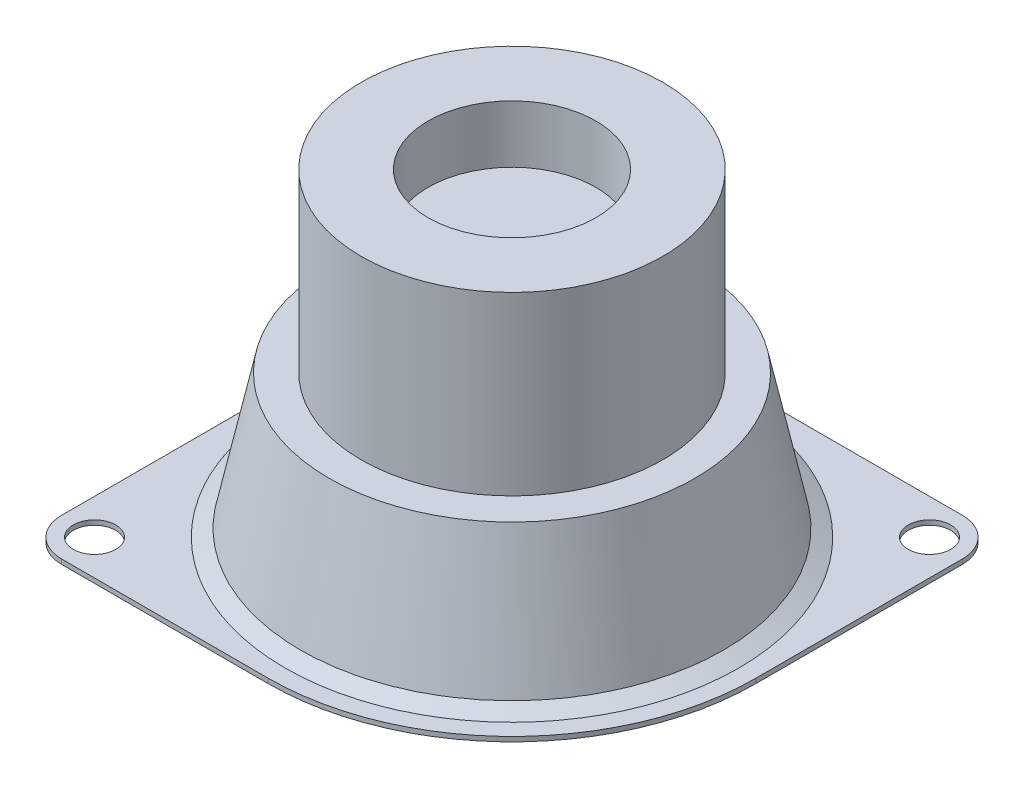
ISO-10303-21;
HEADER;
FILE_DESCRIPTION(('STEP AP214'),'2;1');
FILE_NAME('part.step','',(''),(''),'','','');
FILE_SCHEMA(('AUTOMOTIVE_DESIGN { 1 0 10303 214 1 1 1 1 }'));
ENDSEC;
DATA;
#1=APPLICATION_CONTEXT('core data for automotive mechanical design processes');
#2=APPLICATION_PROTOCOL_DEFINITION('international standard','automotive_design',2000,#1);
#3=PRODUCT_CONTEXT('',#1,'mechanical');
#4=PRODUCT('Part','Part','',(#3));
#5=PRODUCT_RELATED_PRODUCT_CATEGORY('part','',(#4));
#6=PRODUCT_DEFINITION_FORMATION('','',#4);
#7=PRODUCT_DEFINITION_CONTEXT('part definition',#1,'design');
#8=PRODUCT_DEFINITION('design','',#6,#7);
#9=PRODUCT_DEFINITION_SHAPE('','',#8);
#10=(LENGTH_UNIT() NAMED_UNIT(*) SI_UNIT(.MILLI.,.METRE.));
#11=(NAMED_UNIT(*) PLANE_ANGLE_UNIT() SI_UNIT($,.RADIAN.));
#12=(NAMED_UNIT(*) SI_UNIT($,.STERADIAN.) SOLID_ANGLE_UNIT());
#13=UNCERTAINTY_MEASURE_WITH_UNIT(LENGTH_MEASURE(1.E-05),#10,'distance_accuracy_value','');
#14=(GEOMETRIC_REPRESENTATION_CONTEXT(3) GLOBAL_UNCERTAINTY_ASSIGNED_CONTEXT((#13)) GLOBAL_UNIT_ASSIGNED_CONTEXT((#10,
#11,#12)) REPRESENTATION_CONTEXT('',''));
#15=CARTESIAN_POINT('',(0.,0.,0.));
#16=DIRECTION('',(0.,0.,1.));
#17=DIRECTION('',(1.,0.,0.));
#18=AXIS2_PLACEMENT_3D('',#15,#16,#17);
#19=CARTESIAN_POINT('',(0.,1.2,0.));
#20=DIRECTION('',(0.,-1.,0.));
#21=DIRECTION('',(0.,0.,-1.));
#22=AXIS2_PLACEMENT_3D('',#19,#20,#21);
#23=CYLINDRICAL_SURFACE('',#22,25.1);
#24=CARTESIAN_POINT('',(0.,1.17190853383724,0.));
#25=DIRECTION('',(0.,-1.,0.));
#26=DIRECTION('',(0.,0.,-1.));
#27=AXIS2_PLACEMENT_3D('',#24,#25,#26);
#28=CIRCLE('',#27,25.1);
#29=CARTESIAN_POINT('',(0.,1.17190853383724,-25.1));
#30=VERTEX_POINT('',#29);
#31=EDGE_CURVE('E170',#30,#30,#28,.F.);
#32=ORIENTED_EDGE('',*,*,#31,.T.);
#33=EDGE_LOOP('',(#32));
#34=FACE_BOUND('',#33,.T.);
#35=CARTESIAN_POINT('',(0.,1.2,0.));
#36=DIRECTION('',(0.,1.,0.));
#37=DIRECTION('',(0.,0.,1.));
#38=AXIS2_PLACEMENT_3D('',#35,#36,#37);
#39=CIRCLE('',#38,25.1);
#40=CARTESIAN_POINT('',(0.,1.2,25.1));
#41=VERTEX_POINT('',#40);
#42=EDGE_CURVE('E118',#41,#41,#39,.T.);
#43=ORIENTED_EDGE('',*,*,#42,.F.);
#44=EDGE_LOOP('',(#43));
#45=FACE_BOUND('',#44,.T.);
#46=ADVANCED_FACE('F33',(#34,#45),#23,.T.);
#47=CARTESIAN_POINT('',(25.9,1.7,25.9));
#48=DIRECTION('',(-1.,0.,0.));
#49=DIRECTION('',(0.,0.,1.));
#50=AXIS2_PLACEMENT_3D('',#47,#48,#49);
#51=PLANE('',#50);
#52=DIRECTION('',(0.,0.,-1.));
#53=VECTOR('',#52,1.);
#54=CARTESIAN_POINT('',(25.9,1.2,25.9));
#55=LINE('',#54,#53);
#56=CARTESIAN_POINT('',(25.9,1.2,0.));
#57=VERTEX_POINT('',#56);
#58=CARTESIAN_POINT('',(25.9,1.2,-21.9));
#59=VERTEX_POINT('',#58);
#60=EDGE_CURVE('E128',#57,#59,#55,.T.);
#61=ORIENTED_EDGE('',*,*,#60,.T.);
#62=DIRECTION('',(0.,-1.,0.));
#63=VECTOR('',#62,1.);
#64=CARTESIAN_POINT('',(25.9,1.7,-21.9));
#65=LINE('',#64,#63);
#66=CARTESIAN_POINT('',(25.9,1.7,-21.9));
#67=VERTEX_POINT('',#66);
#68=EDGE_CURVE('E48',#59,#67,#65,.F.);
#69=ORIENTED_EDGE('',*,*,#68,.T.);
#70=DIRECTION('',(0.,0.,-1.));
#71=VECTOR('',#70,1.);
#72=CARTESIAN_POINT('',(25.9,1.7,25.9));
#73=LINE('',#72,#71);
#74=CARTESIAN_POINT('',(25.9,1.7,0.));
#75=VERTEX_POINT('',#74);
#76=EDGE_CURVE('E126',#75,#67,#73,.T.);
#77=ORIENTED_EDGE('',*,*,#76,.F.);
#78=DIRECTION('',(0.,-1.,0.));
#79=VECTOR('',#78,1.);
#80=CARTESIAN_POINT('',(25.9,1.7,0.));
#81=LINE('',#80,#79);
#82=EDGE_CURVE('E138',#75,#57,#81,.T.);
#83=ORIENTED_EDGE('',*,*,#82,.T.);
#84=EDGE_LOOP('',(#61,#69,#77,#83));
#85=FACE_BOUND('',#84,.T.);
#86=ADVANCED_FACE('F189',(#85),#51,.F.);
#87=CARTESIAN_POINT('',(-25.9,1.7,-25.9));
#88=DIRECTION('',(0.,0.,1.));
#89=DIRECTION('',(1.,0.,0.));
#90=AXIS2_PLACEMENT_3D('',#87,#88,#89);
#91=PLANE('',#90);
#92=DIRECTION('',(-1.,0.,0.));
#93=VECTOR('',#92,1.);
#94=CARTESIAN_POINT('',(-25.9,1.7,-25.9));
#95=LINE('',#94,#93);
#96=CARTESIAN_POINT('',(21.9,1.7,-25.9));
#97=VERTEX_POINT('',#96);
#98=CARTESIAN_POINT('',(0.,1.7,-25.9));
#99=VERTEX_POINT('',#98);
#100=EDGE_CURVE('E277',#97,#99,#95,.T.);
#101=ORIENTED_EDGE('',*,*,#100,.F.);
#102=DIRECTION('',(0.,-1.,0.));
#103=VECTOR('',#102,1.);
#104=CARTESIAN_POINT('',(21.9,1.7,-25.9));
#105=LINE('',#104,#103);
#106=CARTESIAN_POINT('',(21.9,1.2,-25.9));
#107=VERTEX_POINT('',#106);
#108=EDGE_CURVE('E163',#97,#107,#105,.T.);
#109=ORIENTED_EDGE('',*,*,#108,.T.);
#110=DIRECTION('',(-1.,0.,0.));
#111=VECTOR('',#110,1.);
#112=CARTESIAN_POINT('',(-25.9,1.2,-25.9));
#113=LINE('',#112,#111);
#114=CARTESIAN_POINT('',(0.,1.2,-25.9));
#115=VERTEX_POINT('',#114);
#116=EDGE_CURVE('E124',#107,#115,#113,.T.);
#117=ORIENTED_EDGE('',*,*,#116,.T.);
#118=DIRECTION('',(0.,-1.,0.));
#119=VECTOR('',#118,1.);
#120=CARTESIAN_POINT('',(0.,1.7,-25.9));
#121=LINE('',#120,#119);
#122=EDGE_CURVE('E107',#115,#99,#121,.F.);
#123=ORIENTED_EDGE('',*,*,#122,.T.);
#124=EDGE_LOOP('',(#101,#109,#117,#123));
#125=FACE_BOUND('',#124,.T.);
#126=ADVANCED_FACE('F195',(#125),#91,.F.);
#127=CARTESIAN_POINT('',(-25.9,1.7,25.9));
#128=DIRECTION('',(1.,0.,0.));
#129=DIRECTION('',(0.,0.,-1.));
#130=AXIS2_PLACEMENT_3D('',#127,#128,#129);
#131=PLANE('',#130);
#132=DIRECTION('',(0.,0.,1.));
#133=VECTOR('',#132,1.);
#134=CARTESIAN_POINT('',(-25.9,1.2,25.9));
#135=LINE('',#134,#133);
#136=CARTESIAN_POINT('',(-25.9,1.2,0.));
#137=VERTEX_POINT('',#136);
#138=CARTESIAN_POINT('',(-25.9,1.2,21.9));
#139=VERTEX_POINT('',#138);
#140=EDGE_CURVE('E114',#137,#139,#135,.T.);
#141=ORIENTED_EDGE('',*,*,#140,.T.);
#142=DIRECTION('',(0.,-1.,0.));
#143=VECTOR('',#142,1.);
#144=CARTESIAN_POINT('',(-25.9,1.7,21.9));
#145=LINE('',#144,#143);
#146=CARTESIAN_POINT('',(-25.9,1.7,21.9));
#147=VERTEX_POINT('',#146);
#148=EDGE_CURVE('E159',#139,#147,#145,.F.);
#149=ORIENTED_EDGE('',*,*,#148,.T.);
#150=DIRECTION('',(0.,0.,1.));
#151=VECTOR('',#150,1.);
#152=CARTESIAN_POINT('',(-25.9,1.7,25.9));
#153=LINE('',#152,#151);
#154=CARTESIAN_POINT('',(-25.9,1.7,0.));
#155=VERTEX_POINT('',#154);
#156=EDGE_CURVE('E117',#155,#147,#153,.T.);
#157=ORIENTED_EDGE('',*,*,#156,.F.);
#158=DIRECTION('',(0.,-1.,0.));
#159=VECTOR('',#158,1.);
#160=CARTESIAN_POINT('',(-25.9,1.7,0.));
#161=LINE('',#160,#159);
#162=EDGE_CURVE('E105',#155,#137,#161,.T.);
#163=ORIENTED_EDGE('',*,*,#162,.T.);
#164=EDGE_LOOP('',(#141,#149,#157,#163));
#165=FACE_BOUND('',#164,.T.);
#166=ADVANCED_FACE('F113',(#165),#131,.F.);
#167=CARTESIAN_POINT('',(-25.9,1.7,25.9));
#168=DIRECTION('',(0.,0.,-1.));
#169=DIRECTION('',(-1.,0.,0.));
#170=AXIS2_PLACEMENT_3D('',#167,#168,#169);
#171=PLANE('',#170);
#172=DIRECTION('',(1.,0.,0.));
#173=VECTOR('',#172,1.);
#174=CARTESIAN_POINT('',(-25.9,1.7,25.9));
#175=LINE('',#174,#173);
#176=CARTESIAN_POINT('',(-21.9,1.7,25.9));
#177=VERTEX_POINT('',#176);
#178=CARTESIAN_POINT('',(0.,1.7,25.9));
#179=VERTEX_POINT('',#178);
#180=EDGE_CURVE('E133',#177,#179,#175,.T.);
#181=ORIENTED_EDGE('',*,*,#180,.F.);
#182=DIRECTION('',(0.,-1.,0.));
#183=VECTOR('',#182,1.);
#184=CARTESIAN_POINT('',(-21.9,1.7,25.9));
#185=LINE('',#184,#183);
#186=CARTESIAN_POINT('',(-21.9,1.2,25.9));
#187=VERTEX_POINT('',#186);
#188=EDGE_CURVE('E155',#177,#187,#185,.T.);
#189=ORIENTED_EDGE('',*,*,#188,.T.);
#190=DIRECTION('',(1.,0.,0.));
#191=VECTOR('',#190,1.);
#192=CARTESIAN_POINT('',(-25.9,1.2,25.9));
#193=LINE('',#192,#191);
#194=CARTESIAN_POINT('',(0.,1.2,25.9));
#195=VERTEX_POINT('',#194);
#196=EDGE_CURVE('E123',#187,#195,#193,.T.);
#197=ORIENTED_EDGE('',*,*,#196,.T.);
#198=DIRECTION('',(0.,-1.,0.));
#199=VECTOR('',#198,1.);
#200=CARTESIAN_POINT('',(0.,1.7,25.9));
#201=LINE('',#200,#199);
#202=EDGE_CURVE('E144',#195,#179,#201,.F.);
#203=ORIENTED_EDGE('',*,*,#202,.T.);
#204=EDGE_LOOP('',(#181,#189,#197,#203));
#205=FACE_BOUND('',#204,.T.);
#206=ADVANCED_FACE('F263',(#205),#171,.F.);
#207=CARTESIAN_POINT('',(0.,1.7,0.));
#208=DIRECTION('',(0.,-1.,0.));
#209=DIRECTION('',(0.,0.,-1.));
#210=AXIS2_PLACEMENT_3D('',#207,#208,#209);
#211=PLANE('',#210);
#212=CARTESIAN_POINT('',(22.15,1.7,-22.15));
#213=DIRECTION('',(0.,1.,0.));
#214=DIRECTION('',(0.,0.,1.));
#215=AXIS2_PLACEMENT_3D('',#212,#213,#214);
#216=CIRCLE('',#215,2.25);
#217=CARTESIAN_POINT('',(22.15,1.7,-19.9));
#218=VERTEX_POINT('',#217);
#219=EDGE_CURVE('E311',#218,#218,#216,.T.);
#220=ORIENTED_EDGE('',*,*,#219,.F.);
#221=EDGE_LOOP('',(#220));
#222=FACE_BOUND('',#221,.T.);
#223=CARTESIAN_POINT('',(-22.15,1.7,22.15));
#224=DIRECTION('',(0.,1.,0.));
#225=DIRECTION('',(0.,0.,1.));
#226=AXIS2_PLACEMENT_3D('',#223,#224,#225);
#227=CIRCLE('',#226,2.25);
#228=CARTESIAN_POINT('',(-22.15,1.7,24.4));
#229=VERTEX_POINT('',#228);
#230=EDGE_CURVE('E305',#229,#229,#227,.T.);
#231=ORIENTED_EDGE('',*,*,#230,.F.);
#232=EDGE_LOOP('',(#231));
#233=FACE_BOUND('',#232,.T.);
#234=CARTESIAN_POINT('',(0.,1.7,0.));
#235=DIRECTION('',(0.,-1.,0.));
#236=DIRECTION('',(0.,0.,-1.));
#237=AXIS2_PLACEMENT_3D('',#234,#235,#236);
#238=CIRCLE('',#237,22.607488687666);
#239=CARTESIAN_POINT('',(0.,1.7,-22.607488687666));
#240=VERTEX_POINT('',#239);
#241=EDGE_CURVE('E152',#240,#240,#238,.T.);
#242=ORIENTED_EDGE('',*,*,#241,.T.);
#243=EDGE_LOOP('',(#242));
#244=FACE_BOUND('',#243,.T.);
#245=ORIENTED_EDGE('',*,*,#76,.T.);
#246=CARTESIAN_POINT('',(21.9,1.7,-21.9));
#247=DIRECTION('',(0.,-1.,0.));
#248=DIRECTION('',(0.,0.,-1.));
#249=AXIS2_PLACEMENT_3D('',#246,#247,#248);
#250=CIRCLE('',#249,4.);
#251=EDGE_CURVE('E168',#67,#97,#250,.F.);
#252=ORIENTED_EDGE('',*,*,#251,.T.);
#253=ORIENTED_EDGE('',*,*,#100,.T.);
#254=CARTESIAN_POINT('',(0.,1.7,0.));
#255=DIRECTION('',(0.,-1.,0.));
#256=DIRECTION('',(0.,0.,-1.));
#257=AXIS2_PLACEMENT_3D('',#254,#255,#256);
#258=CIRCLE('',#257,25.9);
#259=EDGE_CURVE('E136',#99,#155,#258,.F.);
#260=ORIENTED_EDGE('',*,*,#259,.T.);
#261=ORIENTED_EDGE('',*,*,#156,.T.);
#262=CARTESIAN_POINT('',(-21.9,1.7,21.9));
#263=DIRECTION('',(0.,-1.,0.));
#264=DIRECTION('',(0.,0.,-1.));
#265=AXIS2_PLACEMENT_3D('',#262,#263,#264);
#266=CIRCLE('',#265,4.);
#267=EDGE_CURVE('E161',#147,#177,#266,.F.);
#268=ORIENTED_EDGE('',*,*,#267,.T.);
#269=ORIENTED_EDGE('',*,*,#180,.T.);
#270=CARTESIAN_POINT('',(0.,1.7,0.));
#271=DIRECTION('',(0.,-1.,0.));
#272=DIRECTION('',(0.,0.,-1.));
#273=AXIS2_PLACEMENT_3D('',#270,#271,#272);
#274=CIRCLE('',#273,25.9);
#275=EDGE_CURVE('E147',#179,#75,#274,.F.);
#276=ORIENTED_EDGE('',*,*,#275,.T.);
#277=EDGE_LOOP('',(#245,#252,#253,#260,#261,#268,#269,#276));
#278=FACE_BOUND('',#277,.T.);
#279=ADVANCED_FACE('F260',(#222,#233,#244,#278),#211,.F.);
#280=CARTESIAN_POINT('',(0.,1.2,0.));
#281=DIRECTION('',(0.,-1.,0.));
#282=DIRECTION('',(0.,0.,-1.));
#283=AXIS2_PLACEMENT_3D('',#280,#281,#282);
#284=PLANE('',#283);
#285=CARTESIAN_POINT('',(22.15,1.2,-22.15));
#286=DIRECTION('',(0.,-1.,0.));
#287=DIRECTION('',(0.,0.,-1.));
#288=AXIS2_PLACEMENT_3D('',#285,#286,#287);
#289=CIRCLE('',#288,2.25);
#290=CARTESIAN_POINT('',(22.15,1.2,-24.4));
#291=VERTEX_POINT('',#290);
#292=EDGE_CURVE('E308',#291,#291,#289,.T.);
#293=ORIENTED_EDGE('',*,*,#292,.F.);
#294=EDGE_LOOP('',(#293));
#295=FACE_BOUND('',#294,.T.);
#296=CARTESIAN_POINT('',(-22.15,1.2,22.15));
#297=DIRECTION('',(0.,-1.,0.));
#298=DIRECTION('',(0.,0.,-1.));
#299=AXIS2_PLACEMENT_3D('',#296,#297,#298);
#300=CIRCLE('',#299,2.25);
#301=CARTESIAN_POINT('',(-22.15,1.2,19.9));
#302=VERTEX_POINT('',#301);
#303=EDGE_CURVE('E300',#302,#302,#300,.T.);
#304=ORIENTED_EDGE('',*,*,#303,.F.);
#305=EDGE_LOOP('',(#304));
#306=FACE_BOUND('',#305,.T.);
#307=ORIENTED_EDGE('',*,*,#42,.T.);
#308=EDGE_LOOP('',(#307));
#309=FACE_BOUND('',#308,.T.);
#310=ORIENTED_EDGE('',*,*,#116,.F.);
#311=CARTESIAN_POINT('',(21.9,1.2,-21.9));
#312=DIRECTION('',(0.,-1.,0.));
#313=DIRECTION('',(0.,0.,-1.));
#314=AXIS2_PLACEMENT_3D('',#311,#312,#313);
#315=CIRCLE('',#314,4.);
#316=EDGE_CURVE('E56',#107,#59,#315,.T.);
#317=ORIENTED_EDGE('',*,*,#316,.T.);
#318=ORIENTED_EDGE('',*,*,#60,.F.);
#319=CARTESIAN_POINT('',(0.,1.2,0.));
#320=DIRECTION('',(0.,-1.,0.));
#321=DIRECTION('',(0.,0.,-1.));
#322=AXIS2_PLACEMENT_3D('',#319,#320,#321);
#323=CIRCLE('',#322,25.9);
#324=EDGE_CURVE('E141',#57,#195,#323,.T.);
#325=ORIENTED_EDGE('',*,*,#324,.T.);
#326=ORIENTED_EDGE('',*,*,#196,.F.);
#327=CARTESIAN_POINT('',(-21.9,1.2,21.9));
#328=DIRECTION('',(0.,-1.,0.));
#329=DIRECTION('',(0.,0.,-1.));
#330=AXIS2_PLACEMENT_3D('',#327,#328,#329);
#331=CIRCLE('',#330,4.);
#332=EDGE_CURVE('E122',#187,#139,#331,.T.);
#333=ORIENTED_EDGE('',*,*,#332,.T.);
#334=ORIENTED_EDGE('',*,*,#140,.F.);
#335=CARTESIAN_POINT('',(0.,1.2,0.));
#336=DIRECTION('',(0.,-1.,0.));
#337=DIRECTION('',(0.,0.,-1.));
#338=AXIS2_PLACEMENT_3D('',#335,#336,#337);
#339=CIRCLE('',#338,25.9);
#340=EDGE_CURVE('E101',#137,#115,#339,.T.);
#341=ORIENTED_EDGE('',*,*,#340,.T.);
#342=EDGE_LOOP('',(#310,#317,#318,#325,#326,#333,#334,#341));
#343=FACE_BOUND('',#342,.T.);
#344=ADVANCED_FACE('F120',(#295,#306,#309,#343),#284,.T.);
#345=CARTESIAN_POINT('',(0.,1.7,0.));
#346=DIRECTION('',(0.,-1.,0.));
#347=DIRECTION('',(0.,0.,-1.));
#348=AXIS2_PLACEMENT_3D('',#345,#346,#347);
#349=CYLINDRICAL_SURFACE('',#348,25.9);
#350=ORIENTED_EDGE('',*,*,#259,.F.);
#351=ORIENTED_EDGE('',*,*,#122,.F.);
#352=ORIENTED_EDGE('',*,*,#340,.F.);
#353=ORIENTED_EDGE('',*,*,#162,.F.);
#354=EDGE_LOOP('',(#350,#351,#352,#353));
#355=FACE_BOUND('',#354,.T.);
#356=ADVANCED_FACE('F104',(#355),#349,.T.);
#357=CARTESIAN_POINT('',(0.,1.7,0.));
#358=DIRECTION('',(0.,-1.,0.));
#359=DIRECTION('',(0.,0.,-1.));
#360=AXIS2_PLACEMENT_3D('',#357,#358,#359);
#361=CYLINDRICAL_SURFACE('',#360,25.9);
#362=ORIENTED_EDGE('',*,*,#275,.F.);
#363=ORIENTED_EDGE('',*,*,#202,.F.);
#364=ORIENTED_EDGE('',*,*,#324,.F.);
#365=ORIENTED_EDGE('',*,*,#82,.F.);
#366=EDGE_LOOP('',(#362,#363,#364,#365));
#367=FACE_BOUND('',#366,.T.);
#368=ADVANCED_FACE('F202',(#367),#361,.T.);
#369=CARTESIAN_POINT('',(0.,16.8,0.));
#370=DIRECTION('',(0.,1.,0.));
#371=DIRECTION('',(0.,0.,1.));
#372=AXIS2_PLACEMENT_3D('',#369,#370,#371);
#373=PLANE('',#372);
#374=CARTESIAN_POINT('',(0.,16.8,0.));
#375=DIRECTION('',(0.,1.,0.));
#376=DIRECTION('',(0.,0.,1.));
#377=AXIS2_PLACEMENT_3D('',#374,#375,#376);
#378=CIRCLE('',#377,19.3978846064485);
#379=CARTESIAN_POINT('',(0.,16.8,19.3978846064485));
#380=VERTEX_POINT('',#379);
#381=EDGE_CURVE('E149',#380,#380,#378,.T.);
#382=ORIENTED_EDGE('',*,*,#381,.T.);
#383=EDGE_LOOP('',(#382));
#384=FACE_BOUND('',#383,.T.);
#385=CARTESIAN_POINT('',(0.,16.8,0.));
#386=DIRECTION('',(0.,1.,0.));
#387=DIRECTION('',(0.,0.,1.));
#388=AXIS2_PLACEMENT_3D('',#385,#386,#387);
#389=CIRCLE('',#388,16.);
#390=CARTESIAN_POINT('',(0.,16.8,16.));
#391=VERTEX_POINT('',#390);
#392=EDGE_CURVE('E286',#391,#391,#389,.T.);
#393=ORIENTED_EDGE('',*,*,#392,.F.);
#394=EDGE_LOOP('',(#393));
#395=FACE_BOUND('',#394,.T.);
#396=ADVANCED_FACE('F205',(#384,#395),#373,.T.);
#397=CARTESIAN_POINT('',(0.,35.5,0.));
#398=DIRECTION('',(0.,-1.,0.));
#399=DIRECTION('',(0.,0.,-1.));
#400=AXIS2_PLACEMENT_3D('',#397,#398,#399);
#401=CYLINDRICAL_SURFACE('',#400,16.);
#402=CARTESIAN_POINT('',(0.,35.5,0.));
#403=DIRECTION('',(0.,1.,0.));
#404=DIRECTION('',(0.,0.,1.));
#405=AXIS2_PLACEMENT_3D('',#402,#403,#404);
#406=CIRCLE('',#405,16.);
#407=CARTESIAN_POINT('',(0.,35.5,16.));
#408=VERTEX_POINT('',#407);
#409=EDGE_CURVE('E290',#408,#408,#406,.T.);
#410=ORIENTED_EDGE('',*,*,#409,.F.);
#411=EDGE_LOOP('',(#410));
#412=FACE_BOUND('',#411,.T.);
#413=ORIENTED_EDGE('',*,*,#392,.T.);
#414=EDGE_LOOP('',(#413));
#415=FACE_BOUND('',#414,.T.);
#416=ADVANCED_FACE('F252',(#412,#415),#401,.T.);
#417=CARTESIAN_POINT('',(0.,35.5,0.));
#418=DIRECTION('',(0.,1.,0.));
#419=DIRECTION('',(0.,0.,1.));
#420=AXIS2_PLACEMENT_3D('',#417,#418,#419);
#421=PLANE('',#420);
#422=CARTESIAN_POINT('',(0.,35.5,0.));
#423=DIRECTION('',(0.,1.,0.));
#424=DIRECTION('',(0.,0.,1.));
#425=AXIS2_PLACEMENT_3D('',#422,#423,#424);
#426=CIRCLE('',#425,8.9);
#427=CARTESIAN_POINT('',(0.,35.5,8.9));
#428=VERTEX_POINT('',#427);
#429=EDGE_CURVE('E297',#428,#428,#426,.T.);
#430=ORIENTED_EDGE('',*,*,#429,.F.);
#431=EDGE_LOOP('',(#430));
#432=FACE_BOUND('',#431,.T.);
#433=ORIENTED_EDGE('',*,*,#409,.T.);
#434=EDGE_LOOP('',(#433));
#435=FACE_BOUND('',#434,.T.);
#436=ADVANCED_FACE('F248',(#432,#435),#421,.T.);
#437=CARTESIAN_POINT('',(0.,29.4,0.));
#438=DIRECTION('',(0.,1.,0.));
#439=DIRECTION('',(0.,0.,1.));
#440=AXIS2_PLACEMENT_3D('',#437,#438,#439);
#441=CYLINDRICAL_SURFACE('',#440,8.9);
#442=CARTESIAN_POINT('',(0.,29.4,0.));
#443=DIRECTION('',(0.,1.,0.));
#444=DIRECTION('',(0.,0.,1.));
#445=AXIS2_PLACEMENT_3D('',#442,#443,#444);
#446=CIRCLE('',#445,8.9);
#447=CARTESIAN_POINT('',(0.,29.4,8.9));
#448=VERTEX_POINT('',#447);
#449=EDGE_CURVE('E295',#448,#448,#446,.T.);
#450=ORIENTED_EDGE('',*,*,#449,.F.);
#451=EDGE_LOOP('',(#450));
#452=FACE_BOUND('',#451,.T.);
#453=ORIENTED_EDGE('',*,*,#429,.T.);
#454=EDGE_LOOP('',(#453));
#455=FACE_BOUND('',#454,.T.);
#456=ADVANCED_FACE('F244',(#452,#455),#441,.F.);
#457=CARTESIAN_POINT('',(0.,29.4,0.));
#458=DIRECTION('',(0.,1.,0.));
#459=DIRECTION('',(0.,0.,1.));
#460=AXIS2_PLACEMENT_3D('',#457,#458,#459);
#461=PLANE('',#460);
#462=ORIENTED_EDGE('',*,*,#449,.T.);
#463=EDGE_LOOP('',(#462));
#464=FACE_BOUND('',#463,.T.);
#465=ADVANCED_FACE('F211',(#464),#461,.T.);
#466=CARTESIAN_POINT('',(0.,16.8,0.));
#467=DIRECTION('',(0.,-1.,0.));
#468=DIRECTION('',(0.,0.,-1.));
#469=AXIS2_PLACEMENT_3D('',#466,#467,#468);
#470=CONICAL_SURFACE('',#469,19.3978846064485,0.209439510239327);
#471=ORIENTED_EDGE('',*,*,#241,.F.);
#472=EDGE_LOOP('',(#471));
#473=FACE_BOUND('',#472,.T.);
#474=ORIENTED_EDGE('',*,*,#381,.F.);
#475=EDGE_LOOP('',(#474));
#476=FACE_BOUND('',#475,.T.);
#477=ADVANCED_FACE('F207',(#473,#476),#470,.T.);
#478=CARTESIAN_POINT('',(-22.15,1.7,22.15));
#479=DIRECTION('',(0.,1.,0.));
#480=DIRECTION('',(0.,0.,1.));
#481=AXIS2_PLACEMENT_3D('',#478,#479,#480);
#482=CYLINDRICAL_SURFACE('',#481,2.25);
#483=ORIENTED_EDGE('',*,*,#303,.T.);
#484=EDGE_LOOP('',(#483));
#485=FACE_BOUND('',#484,.T.);
#486=ORIENTED_EDGE('',*,*,#230,.T.);
#487=EDGE_LOOP('',(#486));
#488=FACE_BOUND('',#487,.T.);
#489=ADVANCED_FACE('F210',(#485,#488),#482,.F.);
#490=CARTESIAN_POINT('',(22.15,1.7,-22.15));
#491=DIRECTION('',(0.,1.,0.));
#492=DIRECTION('',(0.,0.,1.));
#493=AXIS2_PLACEMENT_3D('',#490,#491,#492);
#494=CYLINDRICAL_SURFACE('',#493,2.25);
#495=ORIENTED_EDGE('',*,*,#292,.T.);
#496=EDGE_LOOP('',(#495));
#497=FACE_BOUND('',#496,.T.);
#498=ORIENTED_EDGE('',*,*,#219,.T.);
#499=EDGE_LOOP('',(#498));
#500=FACE_BOUND('',#499,.T.);
#501=ADVANCED_FACE('F217',(#497,#500),#494,.F.);
#502=CARTESIAN_POINT('',(-21.9,1.7,21.9));
#503=DIRECTION('',(0.,-1.,0.));
#504=DIRECTION('',(0.,0.,-1.));
#505=AXIS2_PLACEMENT_3D('',#502,#503,#504);
#506=CYLINDRICAL_SURFACE('',#505,4.);
#507=ORIENTED_EDGE('',*,*,#267,.F.);
#508=ORIENTED_EDGE('',*,*,#148,.F.);
#509=ORIENTED_EDGE('',*,*,#332,.F.);
#510=ORIENTED_EDGE('',*,*,#188,.F.);
#511=EDGE_LOOP('',(#507,#508,#509,#510));
#512=FACE_BOUND('',#511,.T.);
#513=ADVANCED_FACE('F213',(#512),#506,.T.);
#514=CARTESIAN_POINT('',(21.9,1.7,-21.9));
#515=DIRECTION('',(0.,-1.,0.));
#516=DIRECTION('',(0.,0.,-1.));
#517=AXIS2_PLACEMENT_3D('',#514,#515,#516);
#518=CYLINDRICAL_SURFACE('',#517,4.);
#519=ORIENTED_EDGE('',*,*,#251,.F.);
#520=ORIENTED_EDGE('',*,*,#68,.F.);
#521=ORIENTED_EDGE('',*,*,#316,.F.);
#522=ORIENTED_EDGE('',*,*,#108,.F.);
#523=EDGE_LOOP('',(#519,#520,#521,#522));
#524=FACE_BOUND('',#523,.T.);
#525=ADVANCED_FACE('F216',(#524),#518,.T.);
#526=CARTESIAN_POINT('',(0.,10.,0.));
#527=DIRECTION('',(0.,-1.,0.));
#528=DIRECTION('',(0.,0.,-1.));
#529=AXIS2_PLACEMENT_3D('',#526,#527,#528);
#530=PLANE('',#529);
#531=CARTESIAN_POINT('',(0.,10.,0.));
#532=DIRECTION('',(0.,-1.,0.));
#533=DIRECTION('',(0.,0.,-1.));
#534=AXIS2_PLACEMENT_3D('',#531,#532,#533);
#535=CIRCLE('',#534,5.6509829663151);
#536=CARTESIAN_POINT('',(0.,10.,5.65098296631509));
#537=VERTEX_POINT('',#536);
#538=EDGE_CURVE('E11',#537,#537,#535,.F.);
#539=ORIENTED_EDGE('',*,*,#538,.T.);
#540=EDGE_LOOP('',(#539));
#541=FACE_BOUND('',#540,.T.);
#542=CARTESIAN_POINT('',(0.,10.,0.));
#543=DIRECTION('',(0.,-1.,0.));
#544=DIRECTION('',(0.,0.,-1.));
#545=AXIS2_PLACEMENT_3D('',#542,#543,#544);
#546=CIRCLE('',#545,7.7738949449489);
#547=CARTESIAN_POINT('',(0.,10.,-7.7738949449489));
#548=VERTEX_POINT('',#547);
#549=EDGE_CURVE('E173',#548,#548,#546,.T.);
#550=ORIENTED_EDGE('',*,*,#549,.T.);
#551=EDGE_LOOP('',(#550));
#552=FACE_BOUND('',#551,.T.);
#553=ADVANCED_FACE('F220',(#541,#552),#530,.T.);
#554=CARTESIAN_POINT('',(0.,10.1905089898888,0.));
#555=DIRECTION('',(0.,-1.,0.));
#556=DIRECTION('',(0.,0.,-1.));
#557=AXIS2_PLACEMENT_3D('',#554,#555,#556);
#558=CONICAL_SURFACE('',#557,7.4,1.09955742875642);
#559=CARTESIAN_POINT('',(0.,1.17190853383724,-25.1));
#560=CARTESIAN_POINT('',(0.,1.2638678199431,-24.9195197390099));
#561=CARTESIAN_POINT('',(0.,1.35582710604896,-24.7390394780198));
#562=CARTESIAN_POINT('',(0.,1.53974567826069,-24.3780789560395));
#563=CARTESIAN_POINT('',(0.,1.63170496436655,-24.1975986950494));
#564=CARTESIAN_POINT('',(0.,1.81562353657828,-23.8366381730692));
#565=CARTESIAN_POINT('',(0.,1.90758282268414,-23.6561579120791));
#566=CARTESIAN_POINT('',(0.,2.09150139489586,-23.2951973900988));
#567=CARTESIAN_POINT('',(0.,2.18346068100172,-23.1147171291087));
#568=CARTESIAN_POINT('',(0.,2.36737925321345,-22.7537566071285));
#569=CARTESIAN_POINT('',(0.,2.45933853931931,-22.5732763461384));
#570=CARTESIAN_POINT('',(0.,2.64325711153103,-22.2123158241582));
#571=CARTESIAN_POINT('',(0.,2.7352163976369,-22.031835563168));
#572=CARTESIAN_POINT('',(0.,2.91913496984862,-21.6708750411878));
#573=CARTESIAN_POINT('',(0.,3.01109425595448,-21.4903947801977));
#574=CARTESIAN_POINT('',(0.,3.19501282816621,-21.1294342582175));
#575=CARTESIAN_POINT('',(0.,3.28697211427207,-20.9489539972273));
#576=CARTESIAN_POINT('',(0.,3.47089068648379,-20.5879934752471));
#577=CARTESIAN_POINT('',(0.,3.56284997258966,-20.407513214257));
#578=CARTESIAN_POINT('',(0.,3.74676854480138,-20.0465526922768));
#579=CARTESIAN_POINT('',(0.,3.83872783090724,-19.8660724312866));
#580=CARTESIAN_POINT('',(0.,4.02264640311897,-19.5051119093064));
#581=CARTESIAN_POINT('',(0.,4.11460568922483,-19.3246316483163));
#582=CARTESIAN_POINT('',(0.,4.29852426143655,-18.9636711263361));
#583=CARTESIAN_POINT('',(0.,4.39048354754241,-18.783190865346));
#584=CARTESIAN_POINT('',(0.,4.57440211975414,-18.4222303433657));
#585=CARTESIAN_POINT('',(0.,4.66636140586,-18.2417500823756));
#586=CARTESIAN_POINT('',(0.,4.85027997807173,-17.8807895603954));
#587=CARTESIAN_POINT('',(0.,4.94223926417759,-17.7003092994053));
#588=CARTESIAN_POINT('',(0.,5.12615783638931,-17.339348777425));
#589=CARTESIAN_POINT('',(0.,5.21811712249517,-17.1588685164349));
#590=CARTESIAN_POINT('',(0.,5.4020356947069,-16.7979079944547));
#591=CARTESIAN_POINT('',(0.,5.49399498081276,-16.6174277334646));
#592=CARTESIAN_POINT('',(0.,5.67791355302448,-16.2564672114843));
#593=CARTESIAN_POINT('',(0.,5.76987283913035,-16.0759869504942));
#594=CARTESIAN_POINT('',(0.,5.95379141134207,-15.715026428514));
#595=CARTESIAN_POINT('',(0.,6.04575069744793,-15.5345461675239));
#596=CARTESIAN_POINT('',(0.,6.22966926965966,-15.1735856455436));
#597=CARTESIAN_POINT('',(0.,6.32162855576552,-14.9931053845535));
#598=CARTESIAN_POINT('',(0.,6.50554712797724,-14.6321448625733));
#599=CARTESIAN_POINT('',(0.,6.5975064140831,-14.4516646015832));
#600=CARTESIAN_POINT('',(0.,6.78142498629483,-14.090704079603));
#601=CARTESIAN_POINT('',(0.,6.87338427240069,-13.9102238186128));
#602=CARTESIAN_POINT('',(0.,7.05730284461242,-13.5492632966326));
#603=CARTESIAN_POINT('',(0.,7.14926213071828,-13.3687830356425));
#604=CARTESIAN_POINT('',(0.,7.33318070293,-13.0078225136623));
#605=CARTESIAN_POINT('',(0.,7.42513998903586,-12.8273422526721));
#606=CARTESIAN_POINT('',(0.,7.60905856124759,-12.4663817306919));
#607=CARTESIAN_POINT('',(0.,7.70101784735345,-12.2859014697018));
#608=CARTESIAN_POINT('',(0.,7.88493641956517,-11.9249409477216));
#609=CARTESIAN_POINT('',(0.,7.97689570567104,-11.7444606867314));
#610=CARTESIAN_POINT('',(0.,8.16081427788276,-11.3835001647512));
#611=CARTESIAN_POINT('',(0.,8.25277356398862,-11.2030199037611));
#612=CARTESIAN_POINT('',(0.,8.43669213620035,-10.8420593817809));
#613=CARTESIAN_POINT('',(0.,8.52865142230621,-10.6615791207908));
#614=CARTESIAN_POINT('',(0.,8.71256999451793,-10.3006185988105));
#615=CARTESIAN_POINT('',(0.,8.80452928062379,-10.1201383378204));
#616=CARTESIAN_POINT('',(0.,8.98844785283552,-9.75917781584017));
#617=CARTESIAN_POINT('',(0.,9.08040713894138,-9.57869755485006));
#618=CARTESIAN_POINT('',(0.,9.26432571115311,-9.21773703286983));
#619=CARTESIAN_POINT('',(0.,9.35628499725897,-9.03725677187971));
#620=CARTESIAN_POINT('',(0.,9.54020356947069,-8.67629624989948));
#621=CARTESIAN_POINT('',(0.,9.63216285557655,-8.49581598890936));
#622=CARTESIAN_POINT('',(0.,9.81608142778828,-8.13485546692913));
#623=CARTESIAN_POINT('',(0.,9.90804071389414,-7.95437520593902));
#624=CARTESIAN_POINT('',(0.,10.,-7.7738949449489));
#625=B_SPLINE_CURVE_WITH_KNOTS('',3,(#559,#560,#561,#562,#563,#564,#565,#566,#567,#568,#569,
#570,#571,#572,#573,#574,#575,#576,#577,#578,#579,#580,#581,#582,#583,#584,#585,#586,#587,#588,
#589,#590,#591,#592,#593,#594,#595,#596,#597,#598,#599,#600,#601,#602,#603,#604,#605,#606,#607,
#608,#609,#610,#611,#612,#613,#614,#615,#616,#617,#618,#619,#620,#621,#622,#623,#624),
.UNSPECIFIED.,.F.,.F.,(4,2,2,2,2,2,2,2,2,2,2,2,2,2,2,2,2,2,2,2,2,2,2,2,2,2,2,2,2,2,2,2,4),(0.,
0.607673196852916,1.21534639370583,1.82301959055874,2.43069278741166,3.03836598426457,
3.64603918111749,4.2537123779704,4.86138557482332,5.46905877167623,6.07673196852914,
6.68440516538206,7.29207836223497,7.89975155908789,8.5074247559408,9.11509795279372,
9.72277114964663,10.3304443464995,10.9381175433525,11.5457907402054,12.1534639370583,
12.7611371339112,13.3688103307641,13.976483527617,14.5841567244699,15.1918299213229,
15.7995031181758,16.4071763150287,17.0148495118816,17.6225227087345,18.2301959055874,
18.8378691024403,19.4455422992933),.UNSPECIFIED.);
#626=EDGE_CURVE('BSEAM185',#30,#548,#625,.T.);
#627=ORIENTED_EDGE('',*,*,#31,.F.);
#628=ORIENTED_EDGE('',*,*,#549,.F.);
#629=ORIENTED_EDGE('',*,*,#626,.T.);
#630=ORIENTED_EDGE('',*,*,#626,.F.);
#631=EDGE_LOOP('',(#627,#629,#628,#630));
#632=FACE_BOUND('',#631,.T.);
#633=ADVANCED_FACE('F185',(#632),#558,.F.);
#634=CARTESIAN_POINT('',(0.,2.,0.));
#635=DIRECTION('',(0.,-1.,0.));
#636=DIRECTION('',(0.,0.,-1.));
#637=AXIS2_PLACEMENT_3D('',#634,#635,#636);
#638=PLANE('',#637);
#639=CARTESIAN_POINT('',(0.,2.,0.));
#640=DIRECTION('',(0.,-1.,0.));
#641=DIRECTION('',(0.,0.,-1.));
#642=AXIS2_PLACEMENT_3D('',#639,#640,#641);
#643=CIRCLE('',#642,0.254914831575612);
#644=CARTESIAN_POINT('',(0.,2.,0.254914831575608));
#645=VERTEX_POINT('',#644);
#646=EDGE_CURVE('E41',#645,#645,#643,.T.);
#647=ORIENTED_EDGE('',*,*,#646,.T.);
#648=EDGE_LOOP('',(#647));
#649=FACE_BOUND('',#648,.T.);
#650=ADVANCED_FACE('F178',(#649),#638,.T.);
#651=CARTESIAN_POINT('',(0.,2.,0.));
#652=DIRECTION('',(0.,1.,0.));
#653=DIRECTION('',(0.,0.,1.));
#654=AXIS2_PLACEMENT_3D('',#651,#652,#653);
#655=CONICAL_SURFACE('',#654,0.254914831575612,0.593411945678078);
#656=CARTESIAN_POINT('',(0.,10.,5.65098296631509));
#657=CARTESIAN_POINT('',(0.,9.91666666666667,5.59477392324489));
#658=CARTESIAN_POINT('',(0.,9.83333333333333,5.53856488017469));
#659=CARTESIAN_POINT('',(0.,9.66666666666667,5.42614679403428));
#660=CARTESIAN_POINT('',(0.,9.58333333333333,5.36993775096408));
#661=CARTESIAN_POINT('',(0.,9.41666666666667,5.25751966482367));
#662=CARTESIAN_POINT('',(0.,9.33333333333333,5.20131062175347));
#663=CARTESIAN_POINT('',(0.,9.16666666666667,5.08889253561306));
#664=CARTESIAN_POINT('',(0.,9.08333333333333,5.03268349254286));
#665=CARTESIAN_POINT('',(0.,8.91666666666667,4.92026540640246));
#666=CARTESIAN_POINT('',(0.,8.83333333333333,4.86405636333225));
#667=CARTESIAN_POINT('',(0.,8.66666666666667,4.75163827719185));
#668=CARTESIAN_POINT('',(0.,8.58333333333333,4.69542923412164));
#669=CARTESIAN_POINT('',(0.,8.41666666666667,4.58301114798124));
#670=CARTESIAN_POINT('',(0.,8.33333333333333,4.52680210491103));
#671=CARTESIAN_POINT('',(0.,8.16666666666667,4.41438401877063));
#672=CARTESIAN_POINT('',(0.,8.08333333333333,4.35817497570043));
#673=CARTESIAN_POINT('',(0.,7.91666666666667,4.24575688956002));
#674=CARTESIAN_POINT('',(0.,7.83333333333333,4.18954784648982));
#675=CARTESIAN_POINT('',(0.,7.66666666666667,4.07712976034941));
#676=CARTESIAN_POINT('',(0.,7.58333333333333,4.02092071727921));
#677=CARTESIAN_POINT('',(0.,7.41666666666667,3.9085026311388));
#678=CARTESIAN_POINT('',(0.,7.33333333333333,3.8522935880686));
#679=CARTESIAN_POINT('',(0.,7.16666666666667,3.73987550192819));
#680=CARTESIAN_POINT('',(0.,7.08333333333333,3.68366645885799));
#681=CARTESIAN_POINT('',(0.,6.91666666666667,3.57124837271758));
#682=CARTESIAN_POINT('',(0.,6.83333333333333,3.51503932964738));
#683=CARTESIAN_POINT('',(0.,6.66666666666667,3.40262124350697));
#684=CARTESIAN_POINT('',(0.,6.58333333333333,3.34641220043677));
#685=CARTESIAN_POINT('',(0.,6.41666666666667,3.23399411429637));
#686=CARTESIAN_POINT('',(0.,6.33333333333333,3.17778507122616));
#687=CARTESIAN_POINT('',(0.,6.16666666666667,3.06536698508576));
#688=CARTESIAN_POINT('',(0.,6.08333333333333,3.00915794201555));
#689=CARTESIAN_POINT('',(0.,5.91666666666667,2.89673985587515));
#690=CARTESIAN_POINT('',(0.,5.83333333333333,2.84053081280494));
#691=CARTESIAN_POINT('',(0.,5.66666666666667,2.72811272666454));
#692=CARTESIAN_POINT('',(0.,5.58333333333333,2.67190368359434));
#693=CARTESIAN_POINT('',(0.,5.41666666666667,2.55948559745393));
#694=CARTESIAN_POINT('',(0.,5.33333333333333,2.50327655438373));
#695=CARTESIAN_POINT('',(0.,5.16666666666667,2.39085846824332));
#696=CARTESIAN_POINT('',(0.,5.08333333333333,2.33464942517312));
#697=CARTESIAN_POINT('',(0.,4.91666666666667,2.22223133903271));
#698=CARTESIAN_POINT('',(0.,4.83333333333333,2.16602229596251));
#699=CARTESIAN_POINT('',(0.,4.66666666666667,2.0536042098221));
#700=CARTESIAN_POINT('',(0.,4.58333333333333,1.9973951667519));
#701=CARTESIAN_POINT('',(0.,4.41666666666667,1.88497708061149));
#702=CARTESIAN_POINT('',(0.,4.33333333333333,1.82876803754129));
#703=CARTESIAN_POINT('',(0.,4.16666666666667,1.71634995140089));
#704=CARTESIAN_POINT('',(0.,4.08333333333333,1.66014090833068));
#705=CARTESIAN_POINT('',(0.,3.91666666666667,1.54772282219028));
#706=CARTESIAN_POINT('',(0.,3.83333333333333,1.49151377912007));
#707=CARTESIAN_POINT('',(0.,3.66666666666667,1.37909569297967));
#708=CARTESIAN_POINT('',(0.,3.58333333333333,1.32288664990946));
#709=CARTESIAN_POINT('',(0.,3.41666666666667,1.21046856376906));
#710=CARTESIAN_POINT('',(0.,3.33333333333333,1.15425952069886));
#711=CARTESIAN_POINT('',(0.,3.16666666666667,1.04184143455845));
#712=CARTESIAN_POINT('',(0.,3.08333333333333,0.985632391488247));
#713=CARTESIAN_POINT('',(0.,2.91666666666667,0.873214305347841));
#714=CARTESIAN_POINT('',(0.,2.83333333333333,0.817005262277638));
#715=CARTESIAN_POINT('',(0.,2.66666666666667,0.704587176137232));
#716=CARTESIAN_POINT('',(0.,2.58333333333333,0.648378133067029));
#717=CARTESIAN_POINT('',(0.,2.41666666666667,0.535960046926623));
#718=CARTESIAN_POINT('',(0.,2.33333333333333,0.47975100385642));
#719=CARTESIAN_POINT('',(0.,2.16666666666667,0.367332917716014));
#720=CARTESIAN_POINT('',(0.,2.08333333333333,0.311123874645811));
#721=CARTESIAN_POINT('',(0.,2.,0.254914831575608));
#722=B_SPLINE_CURVE_WITH_KNOTS('',3,(#656,#657,#658,#659,#660,#661,#662,#663,#664,#665,#666,
#667,#668,#669,#670,#671,#672,#673,#674,#675,#676,#677,#678,#679,#680,#681,#682,#683,#684,#685,
#686,#687,#688,#689,#690,#691,#692,#693,#694,#695,#696,#697,#698,#699,#700,#701,#702,#703,#704,
#705,#706,#707,#708,#709,#710,#711,#712,#713,#714,#715,#716,#717,#718,#719,#720,#721),
.UNSPECIFIED.,.F.,.F.,(4,2,2,2,2,2,2,2,2,2,2,2,2,2,2,2,2,2,2,2,2,2,2,2,2,2,2,2,2,2,2,2,4),(0.,
0.301554487125978,0.603108974251956,0.904663461377932,1.20621794850391,1.50777243562989,
1.80932692275587,2.11088140988184,2.41243589700782,2.7139903841338,3.01554487125978,
3.31709935838575,3.61865384551173,3.92020833263771,4.22176281976369,4.52331730688966,
4.82487179401564,5.12642628114162,5.4279807682676,5.72953525539357,6.03108974251955,
6.33264422964553,6.6341987167715,6.93575320389748,7.23730769102346,7.53886217814944,
7.84041666527542,8.14197115240139,8.44352563952737,8.74508012665335,9.04663461377933,
9.3481891009053,9.64974358803128),.UNSPECIFIED.);
#723=EDGE_CURVE('BSEAM35',#537,#645,#722,.T.);
#724=ORIENTED_EDGE('',*,*,#538,.F.);
#725=ORIENTED_EDGE('',*,*,#646,.F.);
#726=ORIENTED_EDGE('',*,*,#723,.T.);
#727=ORIENTED_EDGE('',*,*,#723,.F.);
#728=EDGE_LOOP('',(#724,#726,#725,#727));
#729=FACE_BOUND('',#728,.T.);
#730=ADVANCED_FACE('F35',(#729),#655,.T.);
#731=CLOSED_SHELL('',(#46,#86,#126,#166,#206,#279,#344,#356,#368,#396,#416,#436,#456,#465,#477,
#489,#501,#513,#525,#553,#633,#650,#730));
#732=MANIFOLD_SOLID_BREP('B2',#731);
#733=ADVANCED_BREP_SHAPE_REPRESENTATION('',(#18,#732),#14);
#734=SHAPE_DEFINITION_REPRESENTATION(#9,#733);
ENDSEC;
END-ISO-10303-21;
